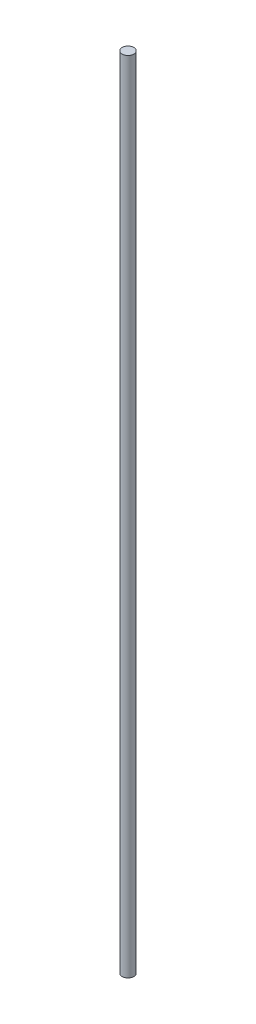
ISO-10303-21;
HEADER;
FILE_DESCRIPTION(('STEP AP214'),'2;1');
FILE_NAME('part.step','',(''),(''),'','','');
FILE_SCHEMA(('AUTOMOTIVE_DESIGN { 1 0 10303 214 1 1 1 1 }'));
ENDSEC;
DATA;
#1=APPLICATION_CONTEXT('core data for automotive mechanical design processes');
#2=APPLICATION_PROTOCOL_DEFINITION('international standard','automotive_design',2000,#1);
#3=PRODUCT_CONTEXT('',#1,'mechanical');
#4=PRODUCT('Part','Part','',(#3));
#5=PRODUCT_RELATED_PRODUCT_CATEGORY('part','',(#4));
#6=PRODUCT_DEFINITION_FORMATION('','',#4);
#7=PRODUCT_DEFINITION_CONTEXT('part definition',#1,'design');
#8=PRODUCT_DEFINITION('design','',#6,#7);
#9=PRODUCT_DEFINITION_SHAPE('','',#8);
#10=(LENGTH_UNIT() NAMED_UNIT(*) SI_UNIT(.MILLI.,.METRE.));
#11=(NAMED_UNIT(*) PLANE_ANGLE_UNIT() SI_UNIT($,.RADIAN.));
#12=(NAMED_UNIT(*) SI_UNIT($,.STERADIAN.) SOLID_ANGLE_UNIT());
#13=UNCERTAINTY_MEASURE_WITH_UNIT(LENGTH_MEASURE(1.E-05),#10,'distance_accuracy_value','');
#14=(GEOMETRIC_REPRESENTATION_CONTEXT(3) GLOBAL_UNCERTAINTY_ASSIGNED_CONTEXT((#13)) GLOBAL_UNIT_ASSIGNED_CONTEXT((#10,
#11,#12)) REPRESENTATION_CONTEXT('',''));
#15=CARTESIAN_POINT('',(0.,0.,0.));
#16=DIRECTION('',(0.,0.,1.));
#17=DIRECTION('',(1.,0.,0.));
#18=AXIS2_PLACEMENT_3D('',#15,#16,#17);
#19=CARTESIAN_POINT('',(0.,550.,0.));
#20=DIRECTION('',(0.,-1.,0.));
#21=DIRECTION('',(0.,0.,-1.));
#22=AXIS2_PLACEMENT_3D('',#19,#20,#21);
#23=CYLINDRICAL_SURFACE('',#22,4.);
#24=CARTESIAN_POINT('',(0.,550.,0.));
#25=DIRECTION('',(0.,1.,0.));
#26=DIRECTION('',(0.,0.,1.));
#27=AXIS2_PLACEMENT_3D('',#24,#25,#26);
#28=CIRCLE('',#27,4.);
#29=CARTESIAN_POINT('',(0.,550.,4.));
#30=VERTEX_POINT('',#29);
#31=EDGE_CURVE('E10',#30,#30,#28,.T.);
#32=ORIENTED_EDGE('',*,*,#31,.F.);
#33=EDGE_LOOP('',(#32));
#34=FACE_BOUND('',#33,.T.);
#35=CARTESIAN_POINT('',(0.,0.,0.));
#36=DIRECTION('',(0.,1.,0.));
#37=DIRECTION('',(0.,0.,1.));
#38=AXIS2_PLACEMENT_3D('',#35,#36,#37);
#39=CIRCLE('',#38,4.);
#40=CARTESIAN_POINT('',(0.,0.,4.));
#41=VERTEX_POINT('',#40);
#42=EDGE_CURVE('E35',#41,#41,#39,.T.);
#43=ORIENTED_EDGE('',*,*,#42,.T.);
#44=EDGE_LOOP('',(#43));
#45=FACE_BOUND('',#44,.T.);
#46=ADVANCED_FACE('F32',(#34,#45),#23,.T.);
#47=CARTESIAN_POINT('',(0.,550.,0.));
#48=DIRECTION('',(0.,1.,0.));
#49=DIRECTION('',(0.,0.,1.));
#50=AXIS2_PLACEMENT_3D('',#47,#48,#49);
#51=PLANE('',#50);
#52=ORIENTED_EDGE('',*,*,#31,.T.);
#53=EDGE_LOOP('',(#52));
#54=FACE_BOUND('',#53,.T.);
#55=ADVANCED_FACE('F47',(#54),#51,.T.);
#56=CARTESIAN_POINT('',(0.,0.,0.));
#57=DIRECTION('',(0.,1.,0.));
#58=DIRECTION('',(0.,0.,1.));
#59=AXIS2_PLACEMENT_3D('',#56,#57,#58);
#60=PLANE('',#59);
#61=ORIENTED_EDGE('',*,*,#42,.F.);
#62=EDGE_LOOP('',(#61));
#63=FACE_BOUND('',#62,.T.);
#64=ADVANCED_FACE('F45',(#63),#60,.F.);
#65=CLOSED_SHELL('',(#46,#55,#64));
#66=MANIFOLD_SOLID_BREP('B2',#65);
#67=ADVANCED_BREP_SHAPE_REPRESENTATION('',(#18,#66),#14);
#68=SHAPE_DEFINITION_REPRESENTATION(#9,#67);
ENDSEC;
END-ISO-10303-21;
